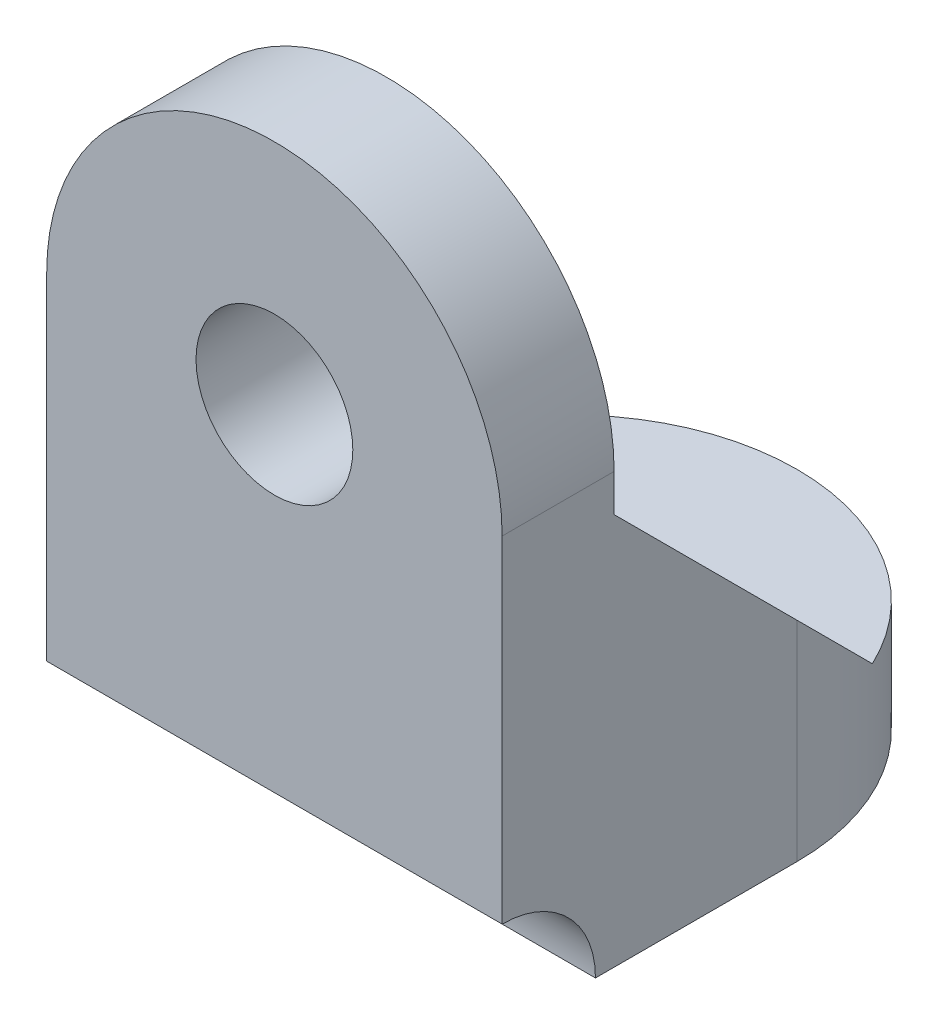
ISO-10303-21;
HEADER;
FILE_DESCRIPTION(('STEP AP214'),'2;1');
FILE_NAME('part.step','',(''),(''),'','','');
FILE_SCHEMA(('AUTOMOTIVE_DESIGN { 1 0 10303 214 1 1 1 1 }'));
ENDSEC;
DATA;
#1=APPLICATION_CONTEXT('core data for automotive mechanical design processes');
#2=APPLICATION_PROTOCOL_DEFINITION('international standard','automotive_design',2000,#1);
#3=PRODUCT_CONTEXT('',#1,'mechanical');
#4=PRODUCT('Part','Part','',(#3));
#5=PRODUCT_RELATED_PRODUCT_CATEGORY('part','',(#4));
#6=PRODUCT_DEFINITION_FORMATION('','',#4);
#7=PRODUCT_DEFINITION_CONTEXT('part definition',#1,'design');
#8=PRODUCT_DEFINITION('design','',#6,#7);
#9=PRODUCT_DEFINITION_SHAPE('','',#8);
#10=(LENGTH_UNIT() NAMED_UNIT(*) SI_UNIT(.MILLI.,.METRE.));
#11=(NAMED_UNIT(*) PLANE_ANGLE_UNIT() SI_UNIT($,.RADIAN.));
#12=(NAMED_UNIT(*) SI_UNIT($,.STERADIAN.) SOLID_ANGLE_UNIT());
#13=UNCERTAINTY_MEASURE_WITH_UNIT(LENGTH_MEASURE(1.E-05),#10,'distance_accuracy_value','');
#14=(GEOMETRIC_REPRESENTATION_CONTEXT(3) GLOBAL_UNCERTAINTY_ASSIGNED_CONTEXT((#13)) GLOBAL_UNIT_ASSIGNED_CONTEXT((#10,
#11,#12)) REPRESENTATION_CONTEXT('',''));
#15=CARTESIAN_POINT('',(0.,0.,0.));
#16=DIRECTION('',(0.,0.,1.));
#17=DIRECTION('',(1.,0.,0.));
#18=AXIS2_PLACEMENT_3D('',#15,#16,#17);
#19=CARTESIAN_POINT('',(0.,0.,0.));
#20=DIRECTION('',(0.,0.,1.));
#21=DIRECTION('',(1.,0.,0.));
#22=AXIS2_PLACEMENT_3D('',#19,#20,#21);
#23=PLANE('',#22);
#24=DIRECTION('',(0.,-1.,0.));
#25=VECTOR('',#24,1.);
#26=CARTESIAN_POINT('',(6.1,0.,0.));
#27=LINE('',#26,#25);
#28=CARTESIAN_POINT('',(6.1,0.,0.));
#29=VERTEX_POINT('',#28);
#30=CARTESIAN_POINT('',(6.1,-1.00249999999995,0.));
#31=VERTEX_POINT('',#30);
#32=EDGE_CURVE('E138',#29,#31,#27,.T.);
#33=ORIENTED_EDGE('',*,*,#32,.T.);
#34=DIRECTION('',(-1.,0.,0.));
#35=VECTOR('',#34,1.);
#36=CARTESIAN_POINT('',(-6.1,-1.00249999999995,0.));
#37=LINE('',#36,#35);
#38=CARTESIAN_POINT('',(1.84526251519942,-1.00249999999995,0.));
#39=VERTEX_POINT('',#38);
#40=EDGE_CURVE('E159',#31,#39,#37,.T.);
#41=ORIENTED_EDGE('',*,*,#40,.T.);
#42=CARTESIAN_POINT('',(0.,0.,0.));
#43=DIRECTION('',(0.,0.,1.));
#44=DIRECTION('',(1.,0.,0.));
#45=AXIS2_PLACEMENT_3D('',#42,#43,#44);
#46=CIRCLE('',#45,2.1);
#47=CARTESIAN_POINT('',(-1.84526251519942,-1.00249999999995,0.));
#48=VERTEX_POINT('',#47);
#49=EDGE_CURVE('E135',#39,#48,#46,.T.);
#50=ORIENTED_EDGE('',*,*,#49,.T.);
#51=DIRECTION('',(-1.,0.,0.));
#52=VECTOR('',#51,1.);
#53=CARTESIAN_POINT('',(-6.1,-1.00249999999995,0.));
#54=LINE('',#53,#52);
#55=CARTESIAN_POINT('',(-6.1,-1.00249999999995,0.));
#56=VERTEX_POINT('',#55);
#57=EDGE_CURVE('E157',#48,#56,#54,.T.);
#58=ORIENTED_EDGE('',*,*,#57,.T.);
#59=DIRECTION('',(0.,-1.,0.));
#60=VECTOR('',#59,1.);
#61=CARTESIAN_POINT('',(-6.1,0.,0.));
#62=LINE('',#61,#60);
#63=CARTESIAN_POINT('',(-6.1,0.,0.));
#64=VERTEX_POINT('',#63);
#65=EDGE_CURVE('E145',#64,#56,#62,.T.);
#66=ORIENTED_EDGE('',*,*,#65,.F.);
#67=CARTESIAN_POINT('',(0.,0.,0.));
#68=DIRECTION('',(0.,0.,1.));
#69=DIRECTION('',(1.,0.,0.));
#70=AXIS2_PLACEMENT_3D('',#67,#68,#69);
#71=CIRCLE('',#70,6.1);
#72=EDGE_CURVE('E142',#29,#64,#71,.T.);
#73=ORIENTED_EDGE('',*,*,#72,.F.);
#74=EDGE_LOOP('',(#33,#41,#50,#58,#66,#73));
#75=FACE_BOUND('',#74,.T.);
#76=ADVANCED_FACE('F38',(#75),#23,.F.);
#77=CARTESIAN_POINT('',(6.1,0.,3.));
#78=DIRECTION('',(1.,0.,0.));
#79=DIRECTION('',(0.,1.,0.));
#80=AXIS2_PLACEMENT_3D('',#77,#78,#79);
#81=PLANE('',#80);
#82=CARTESIAN_POINT('',(6.1,-11.5025,3.));
#83=DIRECTION('',(-1.,0.,0.));
#84=DIRECTION('',(0.,-1.,0.));
#85=AXIS2_PLACEMENT_3D('',#82,#83,#84);
#86=CIRCLE('',#85,2.5);
#87=CARTESIAN_POINT('',(6.1,-9.0025,3.));
#88=VERTEX_POINT('',#87);
#89=CARTESIAN_POINT('',(6.1,-11.5025,0.5));
#90=VERTEX_POINT('',#89);
#91=EDGE_CURVE('E53',#88,#90,#86,.T.);
#92=ORIENTED_EDGE('',*,*,#91,.T.);
#93=DIRECTION('',(0.,0.,-1.));
#94=VECTOR('',#93,1.);
#95=CARTESIAN_POINT('',(6.1,-11.5025,3.));
#96=LINE('',#95,#94);
#97=CARTESIAN_POINT('',(6.1,-11.5025,-4.9));
#98=VERTEX_POINT('',#97);
#99=EDGE_CURVE('E128',#90,#98,#96,.T.);
#100=ORIENTED_EDGE('',*,*,#99,.T.);
#101=DIRECTION('',(0.,-1.,0.));
#102=VECTOR('',#101,1.);
#103=CARTESIAN_POINT('',(6.1,-8.5025,-4.9));
#104=LINE('',#103,#102);
#105=CARTESIAN_POINT('',(6.1,-5.9024999999999,-4.9));
#106=VERTEX_POINT('',#105);
#107=EDGE_CURVE('E139',#106,#98,#104,.T.);
#108=ORIENTED_EDGE('',*,*,#107,.F.);
#109=DIRECTION('',(0.,-0.707106781186544,-0.707106781186551));
#110=VECTOR('',#109,1.);
#111=CARTESIAN_POINT('',(6.1,-8.5025,-7.50000000000013));
#112=LINE('',#111,#110);
#113=EDGE_CURVE('E164',#106,#31,#112,.F.);
#114=ORIENTED_EDGE('',*,*,#113,.T.);
#115=ORIENTED_EDGE('',*,*,#32,.F.);
#116=DIRECTION('',(0.,0.,-1.));
#117=VECTOR('',#116,1.);
#118=CARTESIAN_POINT('',(6.1,0.,3.));
#119=LINE('',#118,#117);
#120=CARTESIAN_POINT('',(6.1,0.,3.));
#121=VERTEX_POINT('',#120);
#122=EDGE_CURVE('E152',#121,#29,#119,.T.);
#123=ORIENTED_EDGE('',*,*,#122,.F.);
#124=DIRECTION('',(0.,-1.,0.));
#125=VECTOR('',#124,1.);
#126=CARTESIAN_POINT('',(6.1,0.,3.));
#127=LINE('',#126,#125);
#128=EDGE_CURVE('E131',#121,#88,#127,.T.);
#129=ORIENTED_EDGE('',*,*,#128,.T.);
#130=EDGE_LOOP('',(#92,#100,#108,#114,#115,#123,#129));
#131=FACE_BOUND('',#130,.T.);
#132=ADVANCED_FACE('F192',(#131),#81,.T.);
#133=CARTESIAN_POINT('',(0.,0.,3.));
#134=DIRECTION('',(0.,0.,-1.));
#135=DIRECTION('',(-1.,0.,0.));
#136=AXIS2_PLACEMENT_3D('',#133,#134,#135);
#137=CYLINDRICAL_SURFACE('',#136,6.1);
#138=ORIENTED_EDGE('',*,*,#72,.T.);
#139=DIRECTION('',(0.,0.,-1.));
#140=VECTOR('',#139,1.);
#141=CARTESIAN_POINT('',(-6.1,0.,3.));
#142=LINE('',#141,#140);
#143=CARTESIAN_POINT('',(-6.1,0.,3.));
#144=VERTEX_POINT('',#143);
#145=EDGE_CURVE('E150',#144,#64,#142,.T.);
#146=ORIENTED_EDGE('',*,*,#145,.F.);
#147=CARTESIAN_POINT('',(0.,0.,3.));
#148=DIRECTION('',(0.,0.,1.));
#149=DIRECTION('',(1.,0.,0.));
#150=AXIS2_PLACEMENT_3D('',#147,#148,#149);
#151=CIRCLE('',#150,6.1);
#152=EDGE_CURVE('E126',#121,#144,#151,.T.);
#153=ORIENTED_EDGE('',*,*,#152,.F.);
#154=ORIENTED_EDGE('',*,*,#122,.T.);
#155=EDGE_LOOP('',(#138,#146,#153,#154));
#156=FACE_BOUND('',#155,.T.);
#157=ADVANCED_FACE('F197',(#156),#137,.T.);
#158=CARTESIAN_POINT('',(-6.1,0.,3.));
#159=DIRECTION('',(1.,0.,0.));
#160=DIRECTION('',(0.,1.,0.));
#161=AXIS2_PLACEMENT_3D('',#158,#159,#160);
#162=PLANE('',#161);
#163=DIRECTION('',(0.,0.,-1.));
#164=VECTOR('',#163,1.);
#165=CARTESIAN_POINT('',(-6.1,-11.5025,3.));
#166=LINE('',#165,#164);
#167=CARTESIAN_POINT('',(-6.1,-11.5025,0.5));
#168=VERTEX_POINT('',#167);
#169=CARTESIAN_POINT('',(-6.1,-11.5025,-4.9));
#170=VERTEX_POINT('',#169);
#171=EDGE_CURVE('E121',#168,#170,#166,.T.);
#172=ORIENTED_EDGE('',*,*,#171,.F.);
#173=CARTESIAN_POINT('',(-6.1,-11.5025,3.));
#174=DIRECTION('',(-1.,0.,0.));
#175=DIRECTION('',(0.,-1.,0.));
#176=AXIS2_PLACEMENT_3D('',#173,#174,#175);
#177=CIRCLE('',#176,2.5);
#178=CARTESIAN_POINT('',(-6.1,-9.0025,3.));
#179=VERTEX_POINT('',#178);
#180=EDGE_CURVE('E109',#179,#168,#177,.T.);
#181=ORIENTED_EDGE('',*,*,#180,.F.);
#182=DIRECTION('',(0.,-1.,0.));
#183=VECTOR('',#182,1.);
#184=CARTESIAN_POINT('',(-6.1,0.,3.));
#185=LINE('',#184,#183);
#186=EDGE_CURVE('E119',#144,#179,#185,.T.);
#187=ORIENTED_EDGE('',*,*,#186,.F.);
#188=ORIENTED_EDGE('',*,*,#145,.T.);
#189=ORIENTED_EDGE('',*,*,#65,.T.);
#190=DIRECTION('',(0.,0.707106781186544,0.707106781186551));
#191=VECTOR('',#190,1.);
#192=CARTESIAN_POINT('',(-6.1,0.998750000000021,2.00124999999999));
#193=LINE('',#192,#191);
#194=CARTESIAN_POINT('',(-6.1,-5.9024999999999,-4.9));
#195=VERTEX_POINT('',#194);
#196=EDGE_CURVE('E168',#56,#195,#193,.F.);
#197=ORIENTED_EDGE('',*,*,#196,.T.);
#198=DIRECTION('',(0.,-1.,0.));
#199=VECTOR('',#198,1.);
#200=CARTESIAN_POINT('',(-6.1,-8.5025,-4.9));
#201=LINE('',#200,#199);
#202=EDGE_CURVE('E61',#195,#170,#201,.T.);
#203=ORIENTED_EDGE('',*,*,#202,.T.);
#204=EDGE_LOOP('',(#172,#181,#187,#188,#189,#197,#203));
#205=FACE_BOUND('',#204,.T.);
#206=ADVANCED_FACE('F117',(#205),#162,.F.);
#207=CARTESIAN_POINT('',(0.,0.,3.));
#208=DIRECTION('',(0.,0.,-1.));
#209=DIRECTION('',(-1.,0.,0.));
#210=AXIS2_PLACEMENT_3D('',#207,#208,#209);
#211=CYLINDRICAL_SURFACE('',#210,2.1);
#212=CARTESIAN_POINT('',(0.,0.,3.));
#213=DIRECTION('',(0.,0.,1.));
#214=DIRECTION('',(1.,0.,0.));
#215=AXIS2_PLACEMENT_3D('',#212,#213,#214);
#216=CIRCLE('',#215,2.1);
#217=CARTESIAN_POINT('',(2.1,0.,3.));
#218=VERTEX_POINT('',#217);
#219=EDGE_CURVE('E147',#218,#218,#216,.T.);
#220=ORIENTED_EDGE('',*,*,#219,.T.);
#221=EDGE_LOOP('',(#220));
#222=FACE_BOUND('',#221,.T.);
#223=ORIENTED_EDGE('',*,*,#49,.F.);
#224=CARTESIAN_POINT('',(0.,0.,1.00249999999996));
#225=DIRECTION('',(0.,0.707106781186551,-0.707106781186544));
#226=DIRECTION('',(0.,-0.707106781186544,-0.707106781186551));
#227=AXIS2_PLACEMENT_3D('',#224,#225,#226);
#228=ELLIPSE('',#227,2.96984848098352,2.1);
#229=EDGE_CURVE('E166',#39,#48,#228,.T.);
#230=ORIENTED_EDGE('',*,*,#229,.T.);
#231=EDGE_LOOP('',(#223,#230));
#232=FACE_BOUND('',#231,.T.);
#233=ADVANCED_FACE('F229',(#222,#232),#211,.F.);
#234=CARTESIAN_POINT('',(0.,-11.5025,3.));
#235=DIRECTION('',(0.,1.,0.));
#236=DIRECTION('',(0.,0.,1.));
#237=AXIS2_PLACEMENT_3D('',#234,#235,#236);
#238=PLANE('',#237);
#239=ORIENTED_EDGE('',*,*,#99,.F.);
#240=DIRECTION('',(-1.,0.,0.));
#241=VECTOR('',#240,1.);
#242=CARTESIAN_POINT('',(6.1,-11.5025,0.5));
#243=LINE('',#242,#241);
#244=EDGE_CURVE('E185',#90,#168,#243,.T.);
#245=ORIENTED_EDGE('',*,*,#244,.T.);
#246=ORIENTED_EDGE('',*,*,#171,.T.);
#247=CARTESIAN_POINT('',(0.,-11.5025,-4.9));
#248=DIRECTION('',(0.,-1.,0.));
#249=DIRECTION('',(0.,0.,-1.));
#250=AXIS2_PLACEMENT_3D('',#247,#248,#249);
#251=CIRCLE('',#250,6.1);
#252=EDGE_CURVE('E181',#170,#98,#251,.T.);
#253=ORIENTED_EDGE('',*,*,#252,.T.);
#254=EDGE_LOOP('',(#239,#245,#246,#253));
#255=FACE_BOUND('',#254,.T.);
#256=CARTESIAN_POINT('',(0.,-11.5025,-4.9));
#257=DIRECTION('',(0.,-1.,0.));
#258=DIRECTION('',(0.,0.,-1.));
#259=AXIS2_PLACEMENT_3D('',#256,#257,#258);
#260=CIRCLE('',#259,2.1);
#261=CARTESIAN_POINT('',(0.,-11.5025,-7.));
#262=VERTEX_POINT('',#261);
#263=EDGE_CURVE('E177',#262,#262,#260,.T.);
#264=ORIENTED_EDGE('',*,*,#263,.F.);
#265=EDGE_LOOP('',(#264));
#266=FACE_BOUND('',#265,.T.);
#267=ADVANCED_FACE('F216',(#255,#266),#238,.F.);
#268=CARTESIAN_POINT('',(0.,0.,3.));
#269=DIRECTION('',(0.,0.,1.));
#270=DIRECTION('',(1.,0.,0.));
#271=AXIS2_PLACEMENT_3D('',#268,#269,#270);
#272=PLANE('',#271);
#273=DIRECTION('',(-1.,0.,0.));
#274=VECTOR('',#273,1.);
#275=CARTESIAN_POINT('',(6.1,-9.0025,3.));
#276=LINE('',#275,#274);
#277=EDGE_CURVE('E11',#88,#179,#276,.T.);
#278=ORIENTED_EDGE('',*,*,#277,.F.);
#279=ORIENTED_EDGE('',*,*,#128,.F.);
#280=ORIENTED_EDGE('',*,*,#152,.T.);
#281=ORIENTED_EDGE('',*,*,#186,.T.);
#282=EDGE_LOOP('',(#278,#279,#280,#281));
#283=FACE_BOUND('',#282,.T.);
#284=ORIENTED_EDGE('',*,*,#219,.F.);
#285=EDGE_LOOP('',(#284));
#286=FACE_BOUND('',#285,.T.);
#287=ADVANCED_FACE('F123',(#283,#286),#272,.T.);
#288=CARTESIAN_POINT('',(0.,-8.5025,0.));
#289=DIRECTION('',(0.,-1.,0.));
#290=DIRECTION('',(0.,0.,-1.));
#291=AXIS2_PLACEMENT_3D('',#288,#289,#290);
#292=PLANE('',#291);
#293=CARTESIAN_POINT('',(0.,-8.5025,-4.9));
#294=DIRECTION('',(0.,-1.,0.));
#295=DIRECTION('',(0.,0.,-1.));
#296=AXIS2_PLACEMENT_3D('',#293,#294,#295);
#297=CIRCLE('',#296,6.1);
#298=CARTESIAN_POINT('',(-5.5181518645285,-8.5025,-7.50000000000013));
#299=VERTEX_POINT('',#298);
#300=CARTESIAN_POINT('',(5.5181518645285,-8.5025,-7.50000000000013));
#301=VERTEX_POINT('',#300);
#302=EDGE_CURVE('E172',#299,#301,#297,.T.);
#303=ORIENTED_EDGE('',*,*,#302,.F.);
#304=DIRECTION('',(1.,0.,0.));
#305=VECTOR('',#304,1.);
#306=CARTESIAN_POINT('',(6.1,-8.5025,-7.50000000000013));
#307=LINE('',#306,#305);
#308=EDGE_CURVE('E154',#299,#301,#307,.T.);
#309=ORIENTED_EDGE('',*,*,#308,.T.);
#310=EDGE_LOOP('',(#303,#309));
#311=FACE_BOUND('',#310,.T.);
#312=ADVANCED_FACE('F207',(#311),#292,.F.);
#313=CARTESIAN_POINT('',(0.,-8.5025,-4.9));
#314=DIRECTION('',(0.,-1.,0.));
#315=DIRECTION('',(0.,0.,-1.));
#316=AXIS2_PLACEMENT_3D('',#313,#314,#315);
#317=CYLINDRICAL_SURFACE('',#316,6.1);
#318=ORIENTED_EDGE('',*,*,#252,.F.);
#319=ORIENTED_EDGE('',*,*,#202,.F.);
#320=CARTESIAN_POINT('',(0.,-5.9024999999999,-4.9));
#321=DIRECTION('',(0.,0.707106781186551,-0.707106781186544));
#322=DIRECTION('',(0.,-0.707106781186544,-0.707106781186551));
#323=AXIS2_PLACEMENT_3D('',#320,#321,#322);
#324=ELLIPSE('',#323,8.62670273047583,6.1);
#325=EDGE_CURVE('E47',#195,#299,#324,.F.);
#326=ORIENTED_EDGE('',*,*,#325,.T.);
#327=ORIENTED_EDGE('',*,*,#302,.T.);
#328=CARTESIAN_POINT('',(0.,-5.9024999999999,-4.9));
#329=DIRECTION('',(0.,0.707106781186551,-0.707106781186544));
#330=DIRECTION('',(0.,-0.707106781186544,-0.707106781186551));
#331=AXIS2_PLACEMENT_3D('',#328,#329,#330);
#332=ELLIPSE('',#331,8.62670273047583,6.1);
#333=EDGE_CURVE('E161',#301,#106,#332,.F.);
#334=ORIENTED_EDGE('',*,*,#333,.T.);
#335=ORIENTED_EDGE('',*,*,#107,.T.);
#336=EDGE_LOOP('',(#318,#319,#326,#327,#334,#335));
#337=FACE_BOUND('',#336,.T.);
#338=ADVANCED_FACE('F205',(#337),#317,.T.);
#339=CARTESIAN_POINT('',(0.,-8.5025,-4.9));
#340=DIRECTION('',(0.,-1.,0.));
#341=DIRECTION('',(0.,0.,-1.));
#342=AXIS2_PLACEMENT_3D('',#339,#340,#341);
#343=CYLINDRICAL_SURFACE('',#342,2.1);
#344=CARTESIAN_POINT('',(0.,-5.9024999999999,-4.9));
#345=DIRECTION('',(0.,0.707106781186551,-0.707106781186544));
#346=DIRECTION('',(0.,-0.707106781186544,-0.707106781186551));
#347=AXIS2_PLACEMENT_3D('',#344,#345,#346);
#348=ELLIPSE('',#347,2.96984848098348,2.1);
#349=CARTESIAN_POINT('',(0.,-8.00249999999988,-7.));
#350=VERTEX_POINT('',#349);
#351=EDGE_CURVE('E170',#350,#350,#348,.F.);
#352=ORIENTED_EDGE('',*,*,#351,.F.);
#353=EDGE_LOOP('',(#352));
#354=FACE_BOUND('',#353,.T.);
#355=ORIENTED_EDGE('',*,*,#263,.T.);
#356=EDGE_LOOP('',(#355));
#357=FACE_BOUND('',#356,.T.);
#358=ADVANCED_FACE('F214',(#354,#357),#343,.F.);
#359=CARTESIAN_POINT('',(0.,-8.5025,-7.50000000000013));
#360=DIRECTION('',(0.,0.707106781186551,-0.707106781186544));
#361=DIRECTION('',(-1.,0.,0.));
#362=AXIS2_PLACEMENT_3D('',#359,#360,#361);
#363=PLANE('',#362);
#364=ORIENTED_EDGE('',*,*,#229,.F.);
#365=ORIENTED_EDGE('',*,*,#40,.F.);
#366=ORIENTED_EDGE('',*,*,#113,.F.);
#367=ORIENTED_EDGE('',*,*,#333,.F.);
#368=ORIENTED_EDGE('',*,*,#308,.F.);
#369=ORIENTED_EDGE('',*,*,#325,.F.);
#370=ORIENTED_EDGE('',*,*,#196,.F.);
#371=ORIENTED_EDGE('',*,*,#57,.F.);
#372=EDGE_LOOP('',(#364,#365,#366,#367,#368,#369,#370,#371));
#373=FACE_BOUND('',#372,.T.);
#374=ORIENTED_EDGE('',*,*,#351,.T.);
#375=EDGE_LOOP('',(#374));
#376=FACE_BOUND('',#375,.T.);
#377=ADVANCED_FACE('F41',(#373,#376),#363,.T.);
#378=CARTESIAN_POINT('',(6.1,-11.5025,3.));
#379=DIRECTION('',(-1.,0.,0.));
#380=DIRECTION('',(0.,-1.,0.));
#381=AXIS2_PLACEMENT_3D('',#378,#379,#380);
#382=CYLINDRICAL_SURFACE('',#381,2.5);
#383=ORIENTED_EDGE('',*,*,#91,.F.);
#384=ORIENTED_EDGE('',*,*,#277,.T.);
#385=ORIENTED_EDGE('',*,*,#180,.T.);
#386=ORIENTED_EDGE('',*,*,#244,.F.);
#387=EDGE_LOOP('',(#383,#384,#385,#386));
#388=FACE_BOUND('',#387,.T.);
#389=ADVANCED_FACE('F108',(#388),#382,.F.);
#390=CLOSED_SHELL('',(#76,#132,#157,#206,#233,#267,#287,#312,#338,#358,#377,#389));
#391=MANIFOLD_SOLID_BREP('B2',#390);
#392=ADVANCED_BREP_SHAPE_REPRESENTATION('',(#18,#391),#14);
#393=SHAPE_DEFINITION_REPRESENTATION(#9,#392);
ENDSEC;
END-ISO-10303-21;
